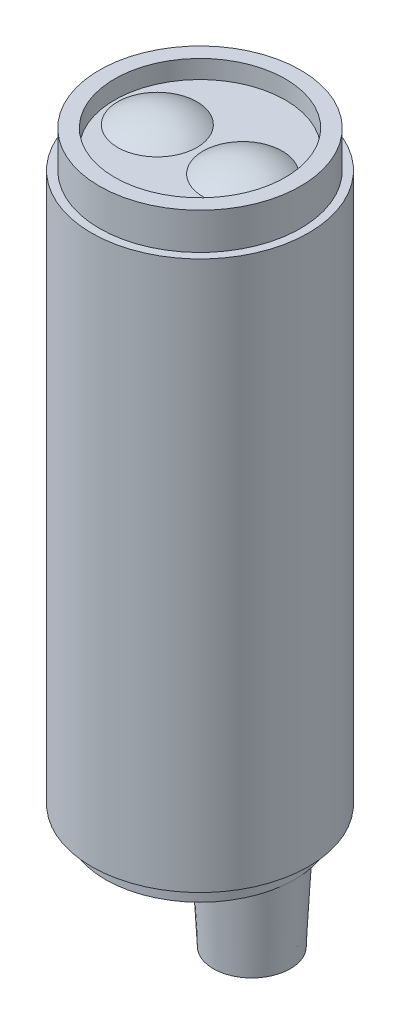
ISO-10303-21;
HEADER;
FILE_DESCRIPTION(('STEP AP214'),'2;1');
FILE_NAME('part.step','',(''),(''),'','','');
FILE_SCHEMA(('AUTOMOTIVE_DESIGN { 1 0 10303 214 1 1 1 1 }'));
ENDSEC;
DATA;
#1=APPLICATION_CONTEXT('core data for automotive mechanical design processes');
#2=APPLICATION_PROTOCOL_DEFINITION('international standard','automotive_design',2000,#1);
#3=PRODUCT_CONTEXT('',#1,'mechanical');
#4=PRODUCT('Part','Part','',(#3));
#5=PRODUCT_RELATED_PRODUCT_CATEGORY('part','',(#4));
#6=PRODUCT_DEFINITION_FORMATION('','',#4);
#7=PRODUCT_DEFINITION_CONTEXT('part definition',#1,'design');
#8=PRODUCT_DEFINITION('design','',#6,#7);
#9=PRODUCT_DEFINITION_SHAPE('','',#8);
#10=(LENGTH_UNIT() NAMED_UNIT(*) SI_UNIT(.MILLI.,.METRE.));
#11=(NAMED_UNIT(*) PLANE_ANGLE_UNIT() SI_UNIT($,.RADIAN.));
#12=(NAMED_UNIT(*) SI_UNIT($,.STERADIAN.) SOLID_ANGLE_UNIT());
#13=UNCERTAINTY_MEASURE_WITH_UNIT(LENGTH_MEASURE(1.E-05),#10,'distance_accuracy_value','');
#14=(GEOMETRIC_REPRESENTATION_CONTEXT(3) GLOBAL_UNCERTAINTY_ASSIGNED_CONTEXT((#13)) GLOBAL_UNIT_ASSIGNED_CONTEXT((#10,
#11,#12)) REPRESENTATION_CONTEXT('',''));
#15=CARTESIAN_POINT('',(0.,0.,0.));
#16=DIRECTION('',(0.,0.,1.));
#17=DIRECTION('',(1.,0.,0.));
#18=AXIS2_PLACEMENT_3D('',#15,#16,#17);
#19=CARTESIAN_POINT('',(0.,-1.5,0.));
#20=DIRECTION('',(0.,1.,0.));
#21=DIRECTION('',(0.,0.,1.));
#22=AXIS2_PLACEMENT_3D('',#19,#20,#21);
#23=CYLINDRICAL_SURFACE('',#22,7.75);
#24=CARTESIAN_POINT('',(0.,-1.5,0.));
#25=DIRECTION('',(0.,-1.,0.));
#26=DIRECTION('',(0.,0.,-1.));
#27=AXIS2_PLACEMENT_3D('',#24,#25,#26);
#28=CIRCLE('',#27,7.75);
#29=CARTESIAN_POINT('',(7.75,-1.5,0.));
#30=VERTEX_POINT('',#29);
#31=EDGE_CURVE('E12',#30,#30,#28,.T.);
#32=ORIENTED_EDGE('',*,*,#31,.F.);
#33=EDGE_LOOP('',(#32));
#34=FACE_BOUND('',#33,.T.);
#35=CARTESIAN_POINT('',(0.,0.,0.));
#36=DIRECTION('',(0.,-1.,0.));
#37=DIRECTION('',(0.,0.,-1.));
#38=AXIS2_PLACEMENT_3D('',#35,#36,#37);
#39=CIRCLE('',#38,7.75);
#40=CARTESIAN_POINT('',(0.,0.,-7.75));
#41=VERTEX_POINT('',#40);
#42=EDGE_CURVE('E58',#41,#41,#39,.T.);
#43=ORIENTED_EDGE('',*,*,#42,.T.);
#44=EDGE_LOOP('',(#43));
#45=FACE_BOUND('',#44,.T.);
#46=ADVANCED_FACE('F55',(#34,#45),#23,.T.);
#47=CARTESIAN_POINT('',(0.,-1.5,0.));
#48=DIRECTION('',(0.,-1.,0.));
#49=DIRECTION('',(0.,0.,-1.));
#50=AXIS2_PLACEMENT_3D('',#47,#48,#49);
#51=PLANE('',#50);
#52=ORIENTED_EDGE('',*,*,#31,.T.);
#53=CARTESIAN_POINT('',(4.25,-1.5,0.));
#54=DIRECTION('',(0.,-1.,0.));
#55=DIRECTION('',(0.,0.,-1.));
#56=AXIS2_PLACEMENT_3D('',#53,#54,#55);
#57=CIRCLE('',#56,3.5);
#58=EDGE_CURVE('E69',#30,#30,#57,.T.);
#59=ORIENTED_EDGE('',*,*,#58,.F.);
#60=EDGE_LOOP('',(#52,#59));
#61=FACE_BOUND('',#60,.T.);
#62=ADVANCED_FACE('F67',(#61),#51,.T.);
#63=CARTESIAN_POINT('',(0.,0.,0.));
#64=DIRECTION('',(0.,-1.,0.));
#65=DIRECTION('',(0.,0.,-1.));
#66=AXIS2_PLACEMENT_3D('',#63,#64,#65);
#67=PLANE('',#66);
#68=ORIENTED_EDGE('',*,*,#42,.F.);
#69=EDGE_LOOP('',(#68));
#70=FACE_BOUND('',#69,.T.);
#71=ADVANCED_FACE('F80',(#70),#67,.F.);
#72=CARTESIAN_POINT('',(4.25,-1.5,0.));
#73=DIRECTION('',(0.,1.,0.));
#74=DIRECTION('',(0.,0.,-1.));
#75=AXIS2_PLACEMENT_3D('',#72,#73,#74);
#76=CONICAL_SURFACE('',#75,3.5,0.05235987755983);
#77=CARTESIAN_POINT('',(4.25,-8.,0.));
#78=DIRECTION('',(0.,-1.,0.));
#79=DIRECTION('',(0.,0.,-1.));
#80=AXIS2_PLACEMENT_3D('',#77,#78,#79);
#81=CIRCLE('',#80,3.15934943466023);
#82=CARTESIAN_POINT('',(4.25,-8.,-3.15934943466023));
#83=VERTEX_POINT('',#82);
#84=EDGE_CURVE('E71',#83,#83,#81,.T.);
#85=ORIENTED_EDGE('',*,*,#84,.F.);
#86=EDGE_LOOP('',(#85));
#87=FACE_BOUND('',#86,.T.);
#88=ORIENTED_EDGE('',*,*,#58,.T.);
#89=EDGE_LOOP('',(#88));
#90=FACE_BOUND('',#89,.T.);
#91=ADVANCED_FACE('F82',(#87,#90),#76,.T.);
#92=CARTESIAN_POINT('',(4.25,-8.,0.));
#93=DIRECTION('',(0.,-1.,0.));
#94=DIRECTION('',(0.,0.,-1.));
#95=AXIS2_PLACEMENT_3D('',#92,#93,#94);
#96=PLANE('',#95);
#97=ORIENTED_EDGE('',*,*,#84,.T.);
#98=EDGE_LOOP('',(#97));
#99=FACE_BOUND('',#98,.T.);
#100=ADVANCED_FACE('F87',(#99),#96,.T.);
#101=CLOSED_SHELL('',(#46,#62,#71,#91,#100));
#102=MANIFOLD_SOLID_BREP('B2',#101);
#103=CARTESIAN_POINT('',(0.,45.,0.));
#104=DIRECTION('',(0.,-1.,0.));
#105=DIRECTION('',(0.,0.,-1.));
#106=AXIS2_PLACEMENT_3D('',#103,#104,#105);
#107=CYLINDRICAL_SURFACE('',#106,8.9);
#108=CARTESIAN_POINT('',(0.,45.,0.));
#109=DIRECTION('',(0.,1.,0.));
#110=DIRECTION('',(0.,0.,1.));
#111=AXIS2_PLACEMENT_3D('',#108,#109,#110);
#112=CIRCLE('',#111,8.9);
#113=CARTESIAN_POINT('',(0.,45.,-8.9));
#114=VERTEX_POINT('',#113);
#115=EDGE_CURVE('E144',#114,#114,#112,.T.);
#116=CARTESIAN_POINT('',(0.,0.,0.));
#117=DIRECTION('',(0.,1.,0.));
#118=DIRECTION('',(0.,0.,1.));
#119=AXIS2_PLACEMENT_3D('',#116,#117,#118);
#120=CIRCLE('',#119,8.9);
#121=CARTESIAN_POINT('',(0.,0.,-8.9));
#122=VERTEX_POINT('',#121);
#123=EDGE_CURVE('E147',#122,#122,#120,.T.);
#124=CARTESIAN_POINT('',(0.,45.,-8.9));
#125=CARTESIAN_POINT('',(0.,44.53125,-8.9));
#126=CARTESIAN_POINT('',(0.,44.0625,-8.9));
#127=CARTESIAN_POINT('',(0.,43.125,-8.9));
#128=CARTESIAN_POINT('',(0.,42.65625,-8.9));
#129=CARTESIAN_POINT('',(0.,41.71875,-8.9));
#130=CARTESIAN_POINT('',(0.,41.25,-8.9));
#131=CARTESIAN_POINT('',(0.,40.3125,-8.9));
#132=CARTESIAN_POINT('',(0.,39.84375,-8.9));
#133=CARTESIAN_POINT('',(0.,38.90625,-8.9));
#134=CARTESIAN_POINT('',(0.,38.4375,-8.9));
#135=CARTESIAN_POINT('',(0.,37.5,-8.9));
#136=CARTESIAN_POINT('',(0.,37.03125,-8.9));
#137=CARTESIAN_POINT('',(0.,36.09375,-8.9));
#138=CARTESIAN_POINT('',(0.,35.625,-8.9));
#139=CARTESIAN_POINT('',(0.,34.6875,-8.9));
#140=CARTESIAN_POINT('',(0.,34.21875,-8.9));
#141=CARTESIAN_POINT('',(0.,33.28125,-8.9));
#142=CARTESIAN_POINT('',(0.,32.8125,-8.9));
#143=CARTESIAN_POINT('',(0.,31.875,-8.9));
#144=CARTESIAN_POINT('',(0.,31.40625,-8.9));
#145=CARTESIAN_POINT('',(0.,30.46875,-8.9));
#146=CARTESIAN_POINT('',(0.,30.,-8.9));
#147=CARTESIAN_POINT('',(0.,29.0625,-8.9));
#148=CARTESIAN_POINT('',(0.,28.59375,-8.9));
#149=CARTESIAN_POINT('',(0.,27.65625,-8.9));
#150=CARTESIAN_POINT('',(0.,27.1875,-8.9));
#151=CARTESIAN_POINT('',(0.,26.25,-8.9));
#152=CARTESIAN_POINT('',(0.,25.78125,-8.9));
#153=CARTESIAN_POINT('',(0.,24.84375,-8.9));
#154=CARTESIAN_POINT('',(0.,24.375,-8.9));
#155=CARTESIAN_POINT('',(0.,23.4375,-8.9));
#156=CARTESIAN_POINT('',(0.,22.96875,-8.9));
#157=CARTESIAN_POINT('',(0.,22.03125,-8.9));
#158=CARTESIAN_POINT('',(0.,21.5625,-8.9));
#159=CARTESIAN_POINT('',(0.,20.625,-8.9));
#160=CARTESIAN_POINT('',(0.,20.15625,-8.9));
#161=CARTESIAN_POINT('',(0.,19.21875,-8.9));
#162=CARTESIAN_POINT('',(0.,18.75,-8.9));
#163=CARTESIAN_POINT('',(0.,17.8125,-8.9));
#164=CARTESIAN_POINT('',(0.,17.34375,-8.9));
#165=CARTESIAN_POINT('',(0.,16.40625,-8.9));
#166=CARTESIAN_POINT('',(0.,15.9375,-8.9));
#167=CARTESIAN_POINT('',(0.,15.,-8.9));
#168=CARTESIAN_POINT('',(0.,14.53125,-8.9));
#169=CARTESIAN_POINT('',(0.,13.59375,-8.9));
#170=CARTESIAN_POINT('',(0.,13.125,-8.9));
#171=CARTESIAN_POINT('',(0.,12.1875,-8.9));
#172=CARTESIAN_POINT('',(0.,11.71875,-8.9));
#173=CARTESIAN_POINT('',(0.,10.78125,-8.9));
#174=CARTESIAN_POINT('',(0.,10.3125,-8.9));
#175=CARTESIAN_POINT('',(0.,9.37499999999999,-8.9));
#176=CARTESIAN_POINT('',(0.,8.90624999999999,-8.9));
#177=CARTESIAN_POINT('',(0.,7.96874999999999,-8.9));
#178=CARTESIAN_POINT('',(0.,7.5,-8.9));
#179=CARTESIAN_POINT('',(0.,6.56249999999999,-8.9));
#180=CARTESIAN_POINT('',(0.,6.09374999999999,-8.9));
#181=CARTESIAN_POINT('',(0.,5.15624999999999,-8.9));
#182=CARTESIAN_POINT('',(0.,4.68749999999999,-8.9));
#183=CARTESIAN_POINT('',(0.,3.74999999999999,-8.9));
#184=CARTESIAN_POINT('',(0.,3.28124999999999,-8.9));
#185=CARTESIAN_POINT('',(0.,2.34374999999999,-8.9));
#186=CARTESIAN_POINT('',(0.,1.87499999999999,-8.9));
#187=CARTESIAN_POINT('',(0.,0.937499999999992,-8.9));
#188=CARTESIAN_POINT('',(0.,0.468749999999993,-8.9));
#189=CARTESIAN_POINT('',(0.,0.,-8.9));
#190=B_SPLINE_CURVE_WITH_KNOTS('',3,(#124,#125,#126,#127,#128,#129,#130,#131,#132,#133,#134,
#135,#136,#137,#138,#139,#140,#141,#142,#143,#144,#145,#146,#147,#148,#149,#150,#151,#152,#153,
#154,#155,#156,#157,#158,#159,#160,#161,#162,#163,#164,#165,#166,#167,#168,#169,#170,#171,#172,
#173,#174,#175,#176,#177,#178,#179,#180,#181,#182,#183,#184,#185,#186,#187,#188,#189),
.UNSPECIFIED.,.F.,.F.,(4,2,2,2,2,2,2,2,2,2,2,2,2,2,2,2,2,2,2,2,2,2,2,2,2,2,2,2,2,2,2,2,4),(0.,
1.40625,2.8125,4.21874999999999,5.625,7.03125,8.43749999999999,9.84375,11.25,12.65625,14.0625,
15.46875,16.875,18.28125,19.6875,21.09375,22.5,23.90625,25.3125,26.71875,28.125,29.53125,
30.9375,32.34375,33.75,35.15625,36.5625,37.96875,39.375,40.78125,42.1875,43.59375,45.),.UNSPECIFIED.);
#191=EDGE_CURVE('BSEAM127',#114,#122,#190,.T.);
#192=ORIENTED_EDGE('',*,*,#115,.F.);
#193=ORIENTED_EDGE('',*,*,#123,.T.);
#194=ORIENTED_EDGE('',*,*,#191,.T.);
#195=ORIENTED_EDGE('',*,*,#191,.F.);
#196=EDGE_LOOP('',(#192,#194,#193,#195));
#197=FACE_BOUND('',#196,.T.);
#198=ADVANCED_FACE('F127',(#197),#107,.T.);
#199=CARTESIAN_POINT('',(0.,45.,0.));
#200=DIRECTION('',(0.,1.,0.));
#201=DIRECTION('',(0.,0.,1.));
#202=AXIS2_PLACEMENT_3D('',#199,#200,#201);
#203=PLANE('',#202);
#204=CARTESIAN_POINT('',(0.,45.,0.));
#205=DIRECTION('',(0.,1.,0.));
#206=DIRECTION('',(0.,0.,1.));
#207=AXIS2_PLACEMENT_3D('',#204,#205,#206);
#208=CIRCLE('',#207,8.25);
#209=CARTESIAN_POINT('',(0.,45.,8.25));
#210=VERTEX_POINT('',#209);
#211=EDGE_CURVE('E155',#210,#210,#208,.T.);
#212=ORIENTED_EDGE('',*,*,#211,.F.);
#213=EDGE_LOOP('',(#212));
#214=FACE_BOUND('',#213,.T.);
#215=ORIENTED_EDGE('',*,*,#115,.T.);
#216=EDGE_LOOP('',(#215));
#217=FACE_BOUND('',#216,.T.);
#218=ADVANCED_FACE('F181',(#214,#217),#203,.T.);
#219=CARTESIAN_POINT('',(0.,0.,0.));
#220=DIRECTION('',(0.,1.,0.));
#221=DIRECTION('',(0.,0.,1.));
#222=AXIS2_PLACEMENT_3D('',#219,#220,#221);
#223=PLANE('',#222);
#224=ORIENTED_EDGE('',*,*,#123,.F.);
#225=EDGE_LOOP('',(#224));
#226=FACE_BOUND('',#225,.T.);
#227=ADVANCED_FACE('F172',(#226),#223,.F.);
#228=CARTESIAN_POINT('',(0.,48.,0.));
#229=DIRECTION('',(0.,1.,0.));
#230=DIRECTION('',(0.,0.,1.));
#231=AXIS2_PLACEMENT_3D('',#228,#229,#230);
#232=PLANE('',#231);
#233=CARTESIAN_POINT('',(0.,48.,0.));
#234=DIRECTION('',(0.,1.,0.));
#235=DIRECTION('',(0.,0.,1.));
#236=AXIS2_PLACEMENT_3D('',#233,#234,#235);
#237=CIRCLE('',#236,8.25);
#238=CARTESIAN_POINT('',(0.,48.,8.25));
#239=VERTEX_POINT('',#238);
#240=EDGE_CURVE('E151',#239,#239,#237,.T.);
#241=ORIENTED_EDGE('',*,*,#240,.T.);
#242=EDGE_LOOP('',(#241));
#243=FACE_BOUND('',#242,.T.);
#244=CARTESIAN_POINT('',(0.,48.,0.));
#245=DIRECTION('',(0.,1.,0.));
#246=DIRECTION('',(0.,0.,1.));
#247=AXIS2_PLACEMENT_3D('',#244,#245,#246);
#248=CIRCLE('',#247,7.);
#249=CARTESIAN_POINT('',(0.,48.,7.));
#250=VERTEX_POINT('',#249);
#251=EDGE_CURVE('E159',#250,#250,#248,.T.);
#252=ORIENTED_EDGE('',*,*,#251,.F.);
#253=EDGE_LOOP('',(#252));
#254=FACE_BOUND('',#253,.T.);
#255=ADVANCED_FACE('F169',(#243,#254),#232,.T.);
#256=CARTESIAN_POINT('',(0.,48.,0.));
#257=DIRECTION('',(0.,-1.,0.));
#258=DIRECTION('',(0.,0.,-1.));
#259=AXIS2_PLACEMENT_3D('',#256,#257,#258);
#260=CYLINDRICAL_SURFACE('',#259,8.25);
#261=ORIENTED_EDGE('',*,*,#240,.F.);
#262=EDGE_LOOP('',(#261));
#263=FACE_BOUND('',#262,.T.);
#264=ORIENTED_EDGE('',*,*,#211,.T.);
#265=EDGE_LOOP('',(#264));
#266=FACE_BOUND('',#265,.T.);
#267=ADVANCED_FACE('F171',(#263,#266),#260,.T.);
#268=CARTESIAN_POINT('',(0.,48.,0.));
#269=DIRECTION('',(0.,-1.,0.));
#270=DIRECTION('',(0.,0.,-1.));
#271=AXIS2_PLACEMENT_3D('',#268,#269,#270);
#272=CYLINDRICAL_SURFACE('',#271,7.);
#273=CARTESIAN_POINT('',(0.,46.5,0.));
#274=DIRECTION('',(0.,1.,0.));
#275=DIRECTION('',(0.,0.,1.));
#276=AXIS2_PLACEMENT_3D('',#273,#274,#275);
#277=CIRCLE('',#276,7.);
#278=CARTESIAN_POINT('',(0.,46.5,7.));
#279=VERTEX_POINT('',#278);
#280=EDGE_CURVE('E139',#279,#279,#277,.T.);
#281=ORIENTED_EDGE('',*,*,#280,.F.);
#282=EDGE_LOOP('',(#281));
#283=FACE_BOUND('',#282,.T.);
#284=ORIENTED_EDGE('',*,*,#251,.T.);
#285=EDGE_LOOP('',(#284));
#286=FACE_BOUND('',#285,.T.);
#287=ADVANCED_FACE('F167',(#283,#286),#272,.F.);
#288=CARTESIAN_POINT('',(0.,46.5,0.));
#289=DIRECTION('',(0.,1.,0.));
#290=DIRECTION('',(0.,0.,1.));
#291=AXIS2_PLACEMENT_3D('',#288,#289,#290);
#292=PLANE('',#291);
#293=CARTESIAN_POINT('',(3.5,46.5,0.));
#294=DIRECTION('',(0.,1.,0.));
#295=DIRECTION('',(0.,0.,1.));
#296=AXIS2_PLACEMENT_3D('',#293,#294,#295);
#297=CIRCLE('',#296,3.25);
#298=CARTESIAN_POINT('',(3.5,46.5,3.25));
#299=VERTEX_POINT('',#298);
#300=EDGE_CURVE('E54',#299,#299,#297,.T.);
#301=ORIENTED_EDGE('',*,*,#300,.F.);
#302=EDGE_LOOP('',(#301));
#303=FACE_BOUND('',#302,.T.);
#304=CARTESIAN_POINT('',(-3.5,46.5,0.));
#305=DIRECTION('',(0.,1.,0.));
#306=DIRECTION('',(0.,0.,1.));
#307=AXIS2_PLACEMENT_3D('',#304,#305,#306);
#308=CIRCLE('',#307,3.25);
#309=CARTESIAN_POINT('',(-3.5,46.5,3.25));
#310=VERTEX_POINT('',#309);
#311=EDGE_CURVE('E134',#310,#310,#308,.T.);
#312=ORIENTED_EDGE('',*,*,#311,.F.);
#313=EDGE_LOOP('',(#312));
#314=FACE_BOUND('',#313,.T.);
#315=ORIENTED_EDGE('',*,*,#280,.T.);
#316=EDGE_LOOP('',(#315));
#317=FACE_BOUND('',#316,.T.);
#318=ADVANCED_FACE('F222',(#303,#314,#317),#292,.T.);
#319=CARTESIAN_POINT('',(-3.5,41.71875,0.));
#320=DIRECTION('',(0.,-1.,0.));
#321=DIRECTION('',(1.,0.,0.));
#322=AXIS2_PLACEMENT_3D('',#319,#320,#321);
#323=SPHERICAL_SURFACE('',#322,5.78124999999999);
#324=ORIENTED_EDGE('',*,*,#311,.T.);
#325=EDGE_LOOP('',(#324));
#326=FACE_BOUND('',#325,.T.);
#327=ADVANCED_FACE('F229',(#326),#323,.T.);
#328=CARTESIAN_POINT('',(3.5,41.71875,0.));
#329=DIRECTION('',(0.,-1.,0.));
#330=DIRECTION('',(-1.,0.,0.));
#331=AXIS2_PLACEMENT_3D('',#328,#329,#330);
#332=SPHERICAL_SURFACE('',#331,5.78124999999999);
#333=ORIENTED_EDGE('',*,*,#300,.T.);
#334=EDGE_LOOP('',(#333));
#335=FACE_BOUND('',#334,.T.);
#336=ADVANCED_FACE('F235',(#335),#332,.T.);
#337=CLOSED_SHELL('',(#198,#218,#227,#255,#267,#287,#318,#327,#336));
#338=MANIFOLD_SOLID_BREP('B6',#337);
#339=ADVANCED_BREP_SHAPE_REPRESENTATION('',(#18,#102,#338),#14);
#340=SHAPE_DEFINITION_REPRESENTATION(#9,#339);
ENDSEC;
END-ISO-10303-21;
